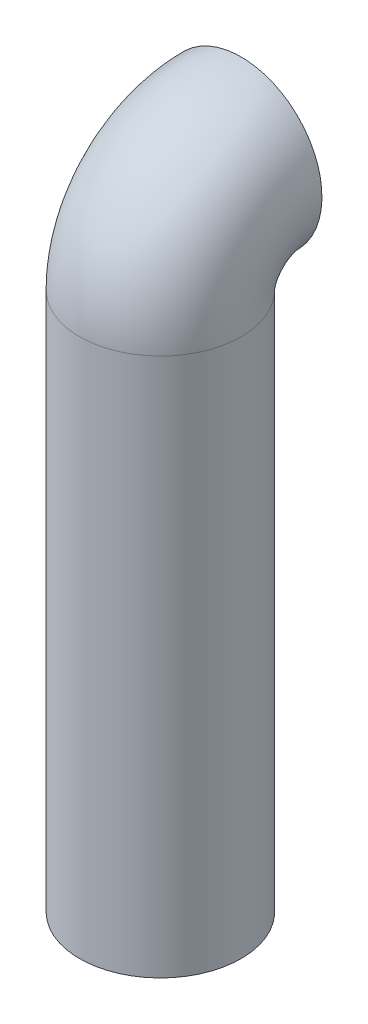
ISO-10303-21;
HEADER;
FILE_DESCRIPTION(('STEP AP214'),'2;1');
FILE_NAME('part.step','',(''),(''),'','','');
FILE_SCHEMA(('AUTOMOTIVE_DESIGN { 1 0 10303 214 1 1 1 1 }'));
ENDSEC;
DATA;
#1=APPLICATION_CONTEXT('core data for automotive mechanical design processes');
#2=APPLICATION_PROTOCOL_DEFINITION('international standard','automotive_design',2000,#1);
#3=PRODUCT_CONTEXT('',#1,'mechanical');
#4=PRODUCT('Part','Part','',(#3));
#5=PRODUCT_RELATED_PRODUCT_CATEGORY('part','',(#4));
#6=PRODUCT_DEFINITION_FORMATION('','',#4);
#7=PRODUCT_DEFINITION_CONTEXT('part definition',#1,'design');
#8=PRODUCT_DEFINITION('design','',#6,#7);
#9=PRODUCT_DEFINITION_SHAPE('','',#8);
#10=(LENGTH_UNIT() NAMED_UNIT(*) SI_UNIT(.MILLI.,.METRE.));
#11=(NAMED_UNIT(*) PLANE_ANGLE_UNIT() SI_UNIT($,.RADIAN.));
#12=(NAMED_UNIT(*) SI_UNIT($,.STERADIAN.) SOLID_ANGLE_UNIT());
#13=UNCERTAINTY_MEASURE_WITH_UNIT(LENGTH_MEASURE(1.E-05),#10,'distance_accuracy_value','');
#14=(GEOMETRIC_REPRESENTATION_CONTEXT(3) GLOBAL_UNCERTAINTY_ASSIGNED_CONTEXT((#13)) GLOBAL_UNIT_ASSIGNED_CONTEXT((#10,
#11,#12)) REPRESENTATION_CONTEXT('',''));
#15=CARTESIAN_POINT('',(0.,0.,0.));
#16=DIRECTION('',(0.,0.,1.));
#17=DIRECTION('',(1.,0.,0.));
#18=AXIS2_PLACEMENT_3D('',#15,#16,#17);
#19=CARTESIAN_POINT('',(0.,45.,0.));
#20=DIRECTION('',(0.,0.,-1.));
#21=DIRECTION('',(0.,1.,0.));
#22=AXIS2_PLACEMENT_3D('',#19,#20,#21);
#23=PLANE('',#22);
#24=CARTESIAN_POINT('',(0.,45.,0.));
#25=DIRECTION('',(0.,0.,-1.));
#26=DIRECTION('',(0.,1.,0.));
#27=AXIS2_PLACEMENT_3D('',#24,#25,#26);
#28=CIRCLE('',#27,10.);
#29=CARTESIAN_POINT('',(0.,55.,0.));
#30=VERTEX_POINT('',#29);
#31=EDGE_CURVE('E101',#30,#30,#28,.T.);
#32=ORIENTED_EDGE('',*,*,#31,.F.);
#33=EDGE_LOOP('',(#32));
#34=FACE_BOUND('',#33,.T.);
#35=CARTESIAN_POINT('',(0.,45.,0.));
#36=DIRECTION('',(0.,0.,-1.));
#37=DIRECTION('',(0.,1.,0.));
#38=AXIS2_PLACEMENT_3D('',#35,#36,#37);
#39=CIRCLE('',#38,45.);
#40=CARTESIAN_POINT('',(0.,0.,0.));
#41=VERTEX_POINT('',#40);
#42=EDGE_CURVE('E11',#41,#41,#39,.T.);
#43=ORIENTED_EDGE('',*,*,#42,.T.);
#44=EDGE_LOOP('',(#43));
#45=FACE_BOUND('',#44,.T.);
#46=ADVANCED_FACE('F38',(#34,#45),#23,.T.);
#47=CARTESIAN_POINT('',(0.,0.,-45.));
#48=DIRECTION('',(0.,-1.,0.));
#49=DIRECTION('',(0.,0.,-1.));
#50=AXIS2_PLACEMENT_3D('',#47,#48,#49);
#51=CIRCLE('',#50,45.);
#52=TRIMMED_CURVE('',#51,(PARAMETER_VALUE(-3.14159263868863)),
(PARAMETER_VALUE(3.14159263868863)),.T.,.PARAMETER.);
#53=CARTESIAN_POINT('',(0.,0.,0.));
#54=DIRECTION('',(1.,0.,0.));
#55=AXIS1_PLACEMENT('',#53,#54);
#56=SURFACE_OF_REVOLUTION('',#52,#55);
#57=CARTESIAN_POINT('',(0.,0.,45.));
#58=DIRECTION('',(0.,-1.,0.));
#59=DIRECTION('',(0.,0.,-1.));
#60=AXIS2_PLACEMENT_3D('',#57,#58,#59);
#61=CIRCLE('',#60,45.);
#62=EDGE_CURVE('E49',#41,#41,#61,.T.);
#63=ORIENTED_EDGE('',*,*,#62,.F.);
#64=ORIENTED_EDGE('',*,*,#42,.F.);
#65=EDGE_LOOP('',(#63,#64));
#66=FACE_BOUND('',#65,.T.);
#67=ADVANCED_FACE('F56',(#66),#56,.T.);
#68=CARTESIAN_POINT('',(0.,45.,20.));
#69=DIRECTION('',(0.,0.,-1.));
#70=DIRECTION('',(0.,1.,0.));
#71=AXIS2_PLACEMENT_3D('',#68,#69,#70);
#72=CYLINDRICAL_SURFACE('',#71,10.);
#73=CARTESIAN_POINT('',(0.,45.,20.));
#74=DIRECTION('',(0.,0.,-1.));
#75=DIRECTION('',(0.,1.,0.));
#76=AXIS2_PLACEMENT_3D('',#73,#74,#75);
#77=CIRCLE('',#76,10.);
#78=CARTESIAN_POINT('',(0.,55.,20.));
#79=VERTEX_POINT('',#78);
#80=EDGE_CURVE('E45',#79,#79,#77,.T.);
#81=ORIENTED_EDGE('',*,*,#80,.F.);
#82=EDGE_LOOP('',(#81));
#83=FACE_BOUND('',#82,.T.);
#84=ORIENTED_EDGE('',*,*,#31,.T.);
#85=EDGE_LOOP('',(#84));
#86=FACE_BOUND('',#85,.T.);
#87=ADVANCED_FACE('F60',(#83,#86),#72,.F.);
#88=CARTESIAN_POINT('',(0.,45.,20.));
#89=DIRECTION('',(0.,0.,-1.));
#90=DIRECTION('',(0.,1.,0.));
#91=AXIS2_PLACEMENT_3D('',#88,#89,#90);
#92=PLANE('',#91);
#93=ORIENTED_EDGE('',*,*,#80,.T.);
#94=EDGE_LOOP('',(#93));
#95=FACE_BOUND('',#94,.T.);
#96=ADVANCED_FACE('F66',(#95),#92,.T.);
#97=CARTESIAN_POINT('',(0.,-300.,45.));
#98=DIRECTION('',(0.,1.,0.));
#99=DIRECTION('',(0.,0.,1.));
#100=AXIS2_PLACEMENT_3D('',#97,#98,#99);
#101=CYLINDRICAL_SURFACE('',#100,45.);
#102=CARTESIAN_POINT('',(0.,-300.,45.));
#103=DIRECTION('',(0.,-1.,0.));
#104=DIRECTION('',(0.,0.,-1.));
#105=AXIS2_PLACEMENT_3D('',#102,#103,#104);
#106=CIRCLE('',#105,45.);
#107=CARTESIAN_POINT('',(0.,-300.,0.));
#108=VERTEX_POINT('',#107);
#109=EDGE_CURVE('E53',#108,#108,#106,.T.);
#110=ORIENTED_EDGE('',*,*,#109,.F.);
#111=EDGE_LOOP('',(#110));
#112=FACE_BOUND('',#111,.T.);
#113=ORIENTED_EDGE('',*,*,#62,.T.);
#114=EDGE_LOOP('',(#113));
#115=FACE_BOUND('',#114,.T.);
#116=ADVANCED_FACE('F51',(#112,#115),#101,.T.);
#117=CARTESIAN_POINT('',(0.,-300.,45.));
#118=DIRECTION('',(0.,-1.,0.));
#119=DIRECTION('',(0.,0.,-1.));
#120=AXIS2_PLACEMENT_3D('',#117,#118,#119);
#121=PLANE('',#120);
#122=CARTESIAN_POINT('',(0.,-300.,45.));
#123=DIRECTION('',(0.,-1.,0.));
#124=DIRECTION('',(0.,0.,-1.));
#125=AXIS2_PLACEMENT_3D('',#122,#123,#124);
#126=CIRCLE('',#125,10.);
#127=CARTESIAN_POINT('',(0.,-300.,35.));
#128=VERTEX_POINT('',#127);
#129=EDGE_CURVE('E95',#128,#128,#126,.T.);
#130=ORIENTED_EDGE('',*,*,#129,.F.);
#131=EDGE_LOOP('',(#130));
#132=FACE_BOUND('',#131,.T.);
#133=ORIENTED_EDGE('',*,*,#109,.T.);
#134=EDGE_LOOP('',(#133));
#135=FACE_BOUND('',#134,.T.);
#136=ADVANCED_FACE('F79',(#132,#135),#121,.T.);
#137=CARTESIAN_POINT('',(0.,-280.,45.));
#138=DIRECTION('',(0.,-1.,0.));
#139=DIRECTION('',(0.,0.,-1.));
#140=AXIS2_PLACEMENT_3D('',#137,#138,#139);
#141=CYLINDRICAL_SURFACE('',#140,10.);
#142=CARTESIAN_POINT('',(0.,-280.,45.));
#143=DIRECTION('',(0.,-1.,0.));
#144=DIRECTION('',(0.,0.,-1.));
#145=AXIS2_PLACEMENT_3D('',#142,#143,#144);
#146=CIRCLE('',#145,10.);
#147=CARTESIAN_POINT('',(0.,-280.,35.));
#148=VERTEX_POINT('',#147);
#149=EDGE_CURVE('E54',#148,#148,#146,.T.);
#150=ORIENTED_EDGE('',*,*,#149,.F.);
#151=EDGE_LOOP('',(#150));
#152=FACE_BOUND('',#151,.T.);
#153=ORIENTED_EDGE('',*,*,#129,.T.);
#154=EDGE_LOOP('',(#153));
#155=FACE_BOUND('',#154,.T.);
#156=ADVANCED_FACE('F83',(#152,#155),#141,.F.);
#157=CARTESIAN_POINT('',(0.,-280.,45.));
#158=DIRECTION('',(0.,-1.,0.));
#159=DIRECTION('',(0.,0.,-1.));
#160=AXIS2_PLACEMENT_3D('',#157,#158,#159);
#161=PLANE('',#160);
#162=ORIENTED_EDGE('',*,*,#149,.T.);
#163=EDGE_LOOP('',(#162));
#164=FACE_BOUND('',#163,.T.);
#165=ADVANCED_FACE('F87',(#164),#161,.T.);
#166=CLOSED_SHELL('',(#46,#67,#87,#96,#116,#136,#156,#165));
#167=MANIFOLD_SOLID_BREP('B2',#166);
#168=ADVANCED_BREP_SHAPE_REPRESENTATION('',(#18,#167),#14);
#169=SHAPE_DEFINITION_REPRESENTATION(#9,#168);
ENDSEC;
END-ISO-10303-21;
